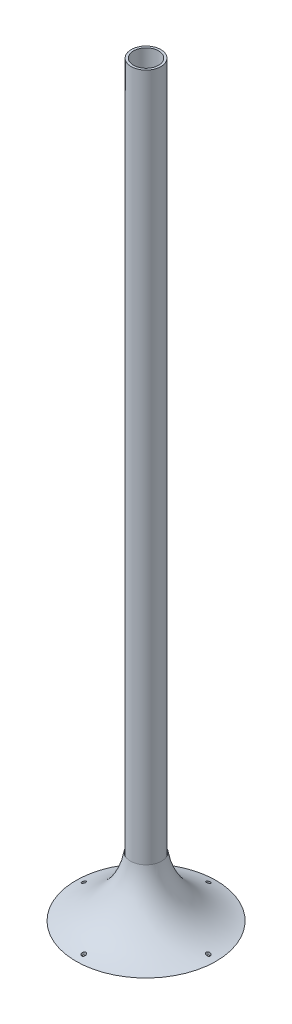
ISO-10303-21;
HEADER;
FILE_DESCRIPTION(('STEP AP214'),'2;1');
FILE_NAME('part.step','',(''),(''),'','','');
FILE_SCHEMA(('AUTOMOTIVE_DESIGN { 1 0 10303 214 1 1 1 1 }'));
ENDSEC;
DATA;
#1=APPLICATION_CONTEXT('core data for automotive mechanical design processes');
#2=APPLICATION_PROTOCOL_DEFINITION('international standard','automotive_design',2000,#1);
#3=PRODUCT_CONTEXT('',#1,'mechanical');
#4=PRODUCT('Part','Part','',(#3));
#5=PRODUCT_RELATED_PRODUCT_CATEGORY('part','',(#4));
#6=PRODUCT_DEFINITION_FORMATION('','',#4);
#7=PRODUCT_DEFINITION_CONTEXT('part definition',#1,'design');
#8=PRODUCT_DEFINITION('design','',#6,#7);
#9=PRODUCT_DEFINITION_SHAPE('','',#8);
#10=(LENGTH_UNIT() NAMED_UNIT(*) SI_UNIT(.MILLI.,.METRE.));
#11=(NAMED_UNIT(*) PLANE_ANGLE_UNIT() SI_UNIT($,.RADIAN.));
#12=(NAMED_UNIT(*) SI_UNIT($,.STERADIAN.) SOLID_ANGLE_UNIT());
#13=UNCERTAINTY_MEASURE_WITH_UNIT(LENGTH_MEASURE(1.E-05),#10,'distance_accuracy_value','');
#14=(GEOMETRIC_REPRESENTATION_CONTEXT(3) GLOBAL_UNCERTAINTY_ASSIGNED_CONTEXT((#13)) GLOBAL_UNIT_ASSIGNED_CONTEXT((#10,
#11,#12)) REPRESENTATION_CONTEXT('',''));
#15=CARTESIAN_POINT('',(0.,0.,0.));
#16=DIRECTION('',(0.,0.,1.));
#17=DIRECTION('',(1.,0.,0.));
#18=AXIS2_PLACEMENT_3D('',#15,#16,#17);
#19=CARTESIAN_POINT('',(0.,0.,0.));
#20=DIRECTION('',(0.,-1.,0.));
#21=DIRECTION('',(1.,0.,0.));
#22=AXIS2_PLACEMENT_3D('',#19,#20,#21);
#23=PLANE('',#22);
#24=CARTESIAN_POINT('',(0.,0.,101.6));
#25=DIRECTION('',(0.,-1.,0.));
#26=DIRECTION('',(1.,0.,0.));
#27=AXIS2_PLACEMENT_3D('',#24,#25,#26);
#28=CIRCLE('',#27,3.2385);
#29=CARTESIAN_POINT('',(3.2385,0.,101.6));
#30=VERTEX_POINT('',#29);
#31=EDGE_CURVE('E88',#30,#30,#28,.T.);
#32=ORIENTED_EDGE('',*,*,#31,.F.);
#33=EDGE_LOOP('',(#32));
#34=FACE_BOUND('',#33,.T.);
#35=CARTESIAN_POINT('',(101.6,0.,-3.54734504026462E-13));
#36=DIRECTION('',(0.,-1.,0.));
#37=DIRECTION('',(1.,0.,0.));
#38=AXIS2_PLACEMENT_3D('',#35,#36,#37);
#39=CIRCLE('',#38,3.2385);
#40=CARTESIAN_POINT('',(104.8385,0.,-3.54734504026462E-13));
#41=VERTEX_POINT('',#40);
#42=EDGE_CURVE('E118',#41,#41,#39,.T.);
#43=ORIENTED_EDGE('',*,*,#42,.F.);
#44=EDGE_LOOP('',(#43));
#45=FACE_BOUND('',#44,.T.);
#46=CARTESIAN_POINT('',(-7.09469008052925E-13,0.,-101.6));
#47=DIRECTION('',(0.,-1.,0.));
#48=DIRECTION('',(1.,0.,0.));
#49=AXIS2_PLACEMENT_3D('',#46,#47,#48);
#50=CIRCLE('',#49,3.2385);
#51=CARTESIAN_POINT('',(3.23849999999929,0.,-101.6));
#52=VERTEX_POINT('',#51);
#53=EDGE_CURVE('E124',#52,#52,#50,.T.);
#54=ORIENTED_EDGE('',*,*,#53,.F.);
#55=EDGE_LOOP('',(#54));
#56=FACE_BOUND('',#55,.T.);
#57=CARTESIAN_POINT('',(-101.6,0.,1.06420351207939E-12));
#58=DIRECTION('',(0.,-1.,0.));
#59=DIRECTION('',(1.,0.,0.));
#60=AXIS2_PLACEMENT_3D('',#57,#58,#59);
#61=CIRCLE('',#60,3.2385);
#62=CARTESIAN_POINT('',(-98.3615,0.,1.06420351207939E-12));
#63=VERTEX_POINT('',#62);
#64=EDGE_CURVE('E130',#63,#63,#61,.T.);
#65=ORIENTED_EDGE('',*,*,#64,.F.);
#66=EDGE_LOOP('',(#65));
#67=FACE_BOUND('',#66,.T.);
#68=CARTESIAN_POINT('',(0.,0.,0.));
#69=DIRECTION('',(0.,-1.,0.));
#70=DIRECTION('',(1.,0.,0.));
#71=AXIS2_PLACEMENT_3D('',#68,#69,#70);
#72=CIRCLE('',#71,114.3);
#73=CARTESIAN_POINT('',(114.3,0.,0.));
#74=VERTEX_POINT('',#73);
#75=EDGE_CURVE('E11',#74,#74,#72,.T.);
#76=ORIENTED_EDGE('',*,*,#75,.T.);
#77=EDGE_LOOP('',(#76));
#78=FACE_BOUND('',#77,.T.);
#79=CARTESIAN_POINT('',(0.,0.,0.));
#80=DIRECTION('',(0.,-1.,0.));
#81=DIRECTION('',(1.,0.,0.));
#82=AXIS2_PLACEMENT_3D('',#79,#80,#81);
#83=CIRCLE('',#82,25.4);
#84=CARTESIAN_POINT('',(25.4,0.,0.));
#85=VERTEX_POINT('',#84);
#86=EDGE_CURVE('E71',#85,#85,#83,.T.);
#87=ORIENTED_EDGE('',*,*,#86,.F.);
#88=EDGE_LOOP('',(#87));
#89=FACE_BOUND('',#88,.T.);
#90=ADVANCED_FACE('F54',(#34,#45,#56,#67,#78,#89),#23,.T.);
#91=CARTESIAN_POINT('',(0.,114.3,0.));
#92=DIRECTION('',(0.,-1.,0.));
#93=DIRECTION('',(1.,0.,0.));
#94=AXIS2_PLACEMENT_3D('',#91,#92,#93);
#95=TOROIDAL_SURFACE('',#94,141.658661971831,117.528661971831);
#96=CARTESIAN_POINT('',(-2.30929525105034,4.64826647005963,99.3295266137908));
#97=CARTESIAN_POINT('',(-2.44354343476462,4.59439528697215,99.4660815845304));
#98=CARTESIAN_POINT('',(-2.56500293451451,4.53650030870473,99.6139158078199));
#99=CARTESIAN_POINT('',(-2.77948637044557,4.41499559766829,99.9271275805299));
#100=CARTESIAN_POINT('',(-2.87245117066994,4.35137432999925,100.092540667176));
#101=CARTESIAN_POINT('',(-3.0276954884374,4.22083571490075,100.435419151226));
#102=CARTESIAN_POINT('',(-3.09005124763107,4.15392701839701,100.612853337364));
#103=CARTESIAN_POINT('',(-3.18316147748261,4.0187257452465,100.9752126998));
#104=CARTESIAN_POINT('',(-3.21392765653977,3.95043369090628,101.160135074233));
#105=CARTESIAN_POINT('',(-3.24365426421682,3.81213743220226,101.538666743752));
#106=CARTESIAN_POINT('',(-3.24156737143667,3.74214821548053,101.732364842528));
#107=CARTESIAN_POINT('',(-3.20277864042161,3.604612329658,102.117199226636));
#108=CARTESIAN_POINT('',(-3.16607176518049,3.53706601747054,102.308335135079));
#109=CARTESIAN_POINT('',(-3.0586723047523,3.40651372910752,102.68166228969));
#110=CARTESIAN_POINT('',(-2.9881007342943,3.34349249751042,102.863882859093));
#111=CARTESIAN_POINT('',(-2.81431150867336,3.22349241317938,103.214231310365));
#112=CARTESIAN_POINT('',(-2.71110053449406,3.1665123270632,103.382362067386));
#113=CARTESIAN_POINT('',(-2.47907188360341,3.06233813689233,103.692389393416));
#114=CARTESIAN_POINT('',(-2.35141866212503,3.01484765309085,103.83505678885));
#115=CARTESIAN_POINT('',(-2.07140053116697,2.92832779424922,104.096771547685));
#116=CARTESIAN_POINT('',(-1.9190438647404,2.88929560695808,104.215826760647));
#117=CARTESIAN_POINT('',(-1.60273999672914,2.82269597761183,104.420042332258));
#118=CARTESIAN_POINT('',(-1.43984871881718,2.79462695763421,104.506675108047));
#119=CARTESIAN_POINT('',(-1.10056775596652,2.74791690453407,104.651329016761));
#120=CARTESIAN_POINT('',(-0.924182029957986,2.72927311840488,104.709358504266));
#121=CARTESIAN_POINT('',(-0.571455967288421,2.70257222027363,104.792598601088));
#122=CARTESIAN_POINT('',(-0.395466859947218,2.69407866896,104.819161712552));
#123=CARTESIAN_POINT('',(-0.0413236174116718,2.68642527222907,104.84309355038));
#124=CARTESIAN_POINT('',(0.136830169613134,2.68726394514806,104.840466911157));
#125=CARTESIAN_POINT('',(0.486254323699183,2.69813166965856,104.806494265508));
#126=CARTESIAN_POINT('',(0.657590560765519,2.7079656595233,104.775757817581));
#127=CARTESIAN_POINT('',(0.99246744235379,2.73628701958079,104.687535053294));
#128=CARTESIAN_POINT('',(1.15600812764337,2.75477434451456,104.630048876842));
#129=CARTESIAN_POINT('',(1.47203367981221,2.80008595395555,104.48982669689));
#130=CARTESIAN_POINT('',(1.62443137440295,2.82696875947887,104.406913529067));
#131=CARTESIAN_POINT('',(1.91302695041082,2.88834905303608,104.218758558631));
#132=CARTESIAN_POINT('',(2.04922285089244,2.92284747073415,104.113514030012));
#133=CARTESIAN_POINT('',(2.30637468364967,2.99985960068305,103.88026625541));
#134=CARTESIAN_POINT('',(2.42669550101881,3.04259640089417,103.751637190987));
#135=CARTESIAN_POINT('',(2.64412979505348,3.13426946475203,103.47803523056));
#136=CARTESIAN_POINT('',(2.7412383932844,3.18320702829161,103.333058908314));
#137=CARTESIAN_POINT('',(2.91452663626111,3.28865612317234,103.023508950751));
#138=CARTESIAN_POINT('',(2.98946428019293,3.3454197408329,102.858326136073));
#139=CARTESIAN_POINT('',(3.11054579022987,3.46315670525127,102.519150879166));
#140=CARTESIAN_POINT('',(3.15668247393687,3.52413109788716,102.345156251128));
#141=CARTESIAN_POINT('',(3.22112401575917,3.65197784318253,101.98408794169));
#142=CARTESIAN_POINT('',(3.23792253013172,3.71899266146435,101.796795215783));
#143=CARTESIAN_POINT('',(3.23904849918665,3.85434895565471,101.422577276663));
#144=CARTESIAN_POINT('',(3.2233687059187,3.92269072431762,101.235652154803));
#145=CARTESIAN_POINT('',(3.15899518025132,4.06105277316863,100.861172591511));
#146=CARTESIAN_POINT('',(3.10925909130126,4.13105661789806,100.673790120216));
#147=CARTESIAN_POINT('',(2.97677876337958,4.26836875091501,100.309980597501));
#148=CARTESIAN_POINT('',(2.89403193856599,4.33567682757933,100.133554405573));
#149=CARTESIAN_POINT('',(2.69778070421146,4.46491316969144,99.7979349917253));
#150=CARTESIAN_POINT('',(2.58444803907258,4.52686899895948,99.6386522893421));
#151=CARTESIAN_POINT('',(2.3293083364836,4.6433534062151,99.3415696006705));
#152=CARTESIAN_POINT('',(2.18750864394508,4.69788389397153,99.2037640892094));
#153=CARTESIAN_POINT('',(1.88675227064989,4.7945074253292,98.9611565367842));
#154=CARTESIAN_POINT('',(1.72900616398302,4.83708561912939,98.8550499253526));
#155=CARTESIAN_POINT('',(1.39534890048712,4.91114087854992,98.6713326671425));
#156=CARTESIAN_POINT('',(1.21944749186623,4.9426238618941,98.5937068289935));
#157=CARTESIAN_POINT('',(0.868366258088667,4.99089705810202,98.4749999153707));
#158=CARTESIAN_POINT('',(0.694072380743383,5.00859257365448,98.4316634836138));
#159=CARTESIAN_POINT('',(0.339957818223821,5.03199014434717,98.3744088832708));
#160=CARTESIAN_POINT('',(0.160139519638052,5.0376973066262,98.3604781875828));
#161=CARTESIAN_POINT('',(-0.189691041294371,5.03683634597694,98.3625823982442));
#162=CARTESIAN_POINT('',(-0.359716798771849,5.03090418465711,98.377064834301));
#163=CARTESIAN_POINT('',(-0.694732987874885,5.0083153699062,98.4323432803409));
#164=CARTESIAN_POINT('',(-0.859722318043035,4.99165638789155,98.4731450037314));
#165=CARTESIAN_POINT('',(-1.17988928506436,4.94844767872076,98.5793747404198));
#166=CARTESIAN_POINT('',(-1.33507979017254,4.9219112529345,98.6447696367641));
#167=CARTESIAN_POINT('',(-1.63199515802965,4.86012672696105,98.7978007871578));
#168=CARTESIAN_POINT('',(-1.77373434979296,4.82488804438653,98.8854130002853));
#169=CARTESIAN_POINT('',(-1.97924394038993,4.7650310404283,99.035152825001));
#170=CARTESIAN_POINT('',(-2.04887380529895,4.74298974604147,99.0904497217147));
#171=CARTESIAN_POINT('',(-2.18300367722266,4.69700516629355,99.2062103989416));
#172=CARTESIAN_POINT('',(-2.24750412696408,4.67306204543901,99.2666737325963));
#173=CARTESIAN_POINT('',(-2.30929525105034,4.64826647005963,99.3295266137908));
#174=B_SPLINE_CURVE_WITH_KNOTS('',3,(#96,#97,#98,#99,#100,#101,#102,#103,#104,#105,#106,#107,
#108,#109,#110,#111,#112,#113,#114,#115,#116,#117,#118,#119,#120,#121,#122,#123,#124,#125,#126,
#127,#128,#129,#130,#131,#132,#133,#134,#135,#136,#137,#138,#139,#140,#141,#142,#143,#144,#145,
#146,#147,#148,#149,#150,#151,#152,#153,#154,#155,#156,#157,#158,#159,#160,#161,#162,#163,#164,
#165,#166,#167,#168,#169,#170,#171,#172,#173),.UNSPECIFIED.,.T.,.F.,(4,2,2,2,2,2,2,2,2,2,2,2,2,
2,2,2,2,2,2,2,2,2,2,2,2,2,2,2,2,2,2,2,2,2,2,2,2,2,4),(0.,0.59642907601406,1.19408768780807,
1.79024998802465,2.38619124609189,3.00116791252539,3.61623406829412,4.22911848384881,
4.84187752875225,5.43057870646303,6.01908384892127,6.57610930088673,7.13297195773208,
7.66491369993202,8.19677098771815,8.71736161937451,9.23794952824931,9.76225041105252,
10.2866153325089,10.8279340805677,11.3693664959491,11.9370320266178,12.5048390655113,
13.1010261440787,13.6973462837626,14.3127853048001,14.9282725447153,15.5403731550182,
16.1523160368729,16.7336964366836,17.3147662814013,17.8533890587149,18.3917823316452,
18.901576036062,19.4114804440759,19.9207006636501,20.4293721999155,20.7039174986347,
20.9784390752027),.UNSPECIFIED.);
#175=CARTESIAN_POINT('',(-2.30929525105034,4.64826647005963,99.3295266137908));
#176=VERTEX_POINT('',#175);
#177=EDGE_CURVE('E59',#176,#176,#174,.T.);
#178=ORIENTED_EDGE('',*,*,#177,.F.);
#179=EDGE_LOOP('',(#178));
#180=FACE_BOUND('',#179,.T.);
#181=CARTESIAN_POINT('',(98.9367420931442,4.80438595188609,-1.84253617917576));
#182=CARTESIAN_POINT('',(98.8399677593906,4.84313834807318,-1.70264812349893));
#183=CARTESIAN_POINT('',(98.7536788961852,4.87790619972581,-1.55431243654883));
#184=CARTESIAN_POINT('',(98.6051011285243,4.93798846619797,-1.24420113424935));
#185=CARTESIAN_POINT('',(98.5428217186514,4.96329914103798,-1.08242023264376));
#186=CARTESIAN_POINT('',(98.4446233471107,5.00329059928821,-0.749434084006235));
#187=CARTESIAN_POINT('',(98.4087513090254,5.01795246007419,-0.578212639259197));
#188=CARTESIAN_POINT('',(98.365080329619,5.03580999905111,-0.23165722455757));
#189=CARTESIAN_POINT('',(98.3572750104721,5.03900828220225,-0.0563241980266586));
#190=CARTESIAN_POINT('',(98.3698644614795,5.0338558995717,0.287910002214199));
#191=CARTESIAN_POINT('',(98.389428153372,5.02584558865043,0.456847482004698));
#192=CARTESIAN_POINT('',(98.4544765131783,4.99928192012043,0.788777305906589));
#193=CARTESIAN_POINT('',(98.4999613357125,4.98072849962171,0.95176961454868));
#194=CARTESIAN_POINT('',(98.6153122783344,4.93386554813559,1.2680579145589));
#195=CARTESIAN_POINT('',(98.6852690380838,4.9055197528765,1.4213153210396));
#196=CARTESIAN_POINT('',(98.8470549286339,4.8403119247384,1.71380467479733));
#197=CARTESIAN_POINT('',(98.9388881737383,4.80344828995117,1.85303397679592));
#198=CARTESIAN_POINT('',(99.1466579500181,4.72057604844975,2.12112751708642));
#199=CARTESIAN_POINT('',(99.2635751190879,4.67420050256016,2.24911716389742));
#200=CARTESIAN_POINT('',(99.514822532309,4.57530847000922,2.48384825809695));
#201=CARTESIAN_POINT('',(99.6491580805682,4.52279011326637,2.59058320796377));
#202=CARTESIAN_POINT('',(99.9415172381204,4.40946064981896,2.78756178921429));
#203=CARTESIAN_POINT('',(100.100539048205,4.34832672497345,2.87613898101627));
#204=CARTESIAN_POINT('',(100.430076169255,4.22287239027717,3.02520950018011));
#205=CARTESIAN_POINT('',(100.600594910884,4.15855103083239,3.08569440199848));
#206=CARTESIAN_POINT('',(100.958610512223,4.02487267738655,3.18003960650001));
#207=CARTESIAN_POINT('',(101.146523165204,3.95543563822972,3.21221558710688));
#208=CARTESIAN_POINT('',(101.525264853861,3.81700651764503,3.24321012362954));
#209=CARTESIAN_POINT('',(101.716094367058,3.74801451176067,3.24202315793215));
#210=CARTESIAN_POINT('',(102.098982865887,3.61107526555774,3.20570677391838));
#211=CARTESIAN_POINT('',(102.290998157702,3.54317165980357,3.16994331210049));
#212=CARTESIAN_POINT('',(102.666847261033,3.41165519705931,3.06395662981789));
#213=CARTESIAN_POINT('',(102.850681665621,3.34804202886141,2.99373591178176));
#214=CARTESIAN_POINT('',(103.200139014324,3.22829372121628,2.82213641319951));
#215=CARTESIAN_POINT('',(103.366083171758,3.17202042595456,2.72150999940001));
#216=CARTESIAN_POINT('',(103.678784418379,3.06687560278763,2.49083325789969));
#217=CARTESIAN_POINT('',(103.825546926471,3.01800198381836,2.36079126870876));
#218=CARTESIAN_POINT('',(104.087752069446,2.93129998177295,2.0817793710843));
#219=CARTESIAN_POINT('',(104.204381450978,2.89304608388134,1.93405751027627));
#220=CARTESIAN_POINT('',(104.410980101924,2.8256355667873,1.61916472783316));
#221=CARTESIAN_POINT('',(104.500958196559,2.79647593596873,1.45200026995048));
#222=CARTESIAN_POINT('',(104.646796190101,2.74937791380621,1.11234006929568));
#223=CARTESIAN_POINT('',(104.704180548028,2.73093697768059,0.940567723448616));
#224=CARTESIAN_POINT('',(104.789585141468,2.70353622154736,0.589152007721813));
#225=CARTESIAN_POINT('',(104.817612257054,2.69457418009049,0.409510492322444));
#226=CARTESIAN_POINT('',(104.842776232322,2.68652675299022,0.0541140750643192));
#227=CARTESIAN_POINT('',(104.840945402515,2.68711130387327,-0.121561109589414));
#228=CARTESIAN_POINT('',(104.808980280939,2.69733603020385,-0.470036455473887));
#229=CARTESIAN_POINT('',(104.778848316397,2.70697546106085,-0.642836851911879));
#230=CARTESIAN_POINT('',(104.69171375365,2.73494383146165,-0.979378277758448));
#231=CARTESIAN_POINT('',(104.634913535853,2.75320733044567,-1.1431773323845));
#232=CARTESIAN_POINT('',(104.496502919491,2.79792403491012,-1.45871194929779));
#233=CARTESIAN_POINT('',(104.414891028467,2.82437773304466,-1.61044678521198));
#234=CARTESIAN_POINT('',(104.227680879256,2.88542790146023,-1.90095634092829));
#235=CARTESIAN_POINT('',(104.121632239248,2.92017777371963,-2.0394081289384));
#236=CARTESIAN_POINT('',(103.889925683343,2.99666025358289,-2.29653921428517));
#237=CARTESIAN_POINT('',(103.764264405419,3.0383940584715,-2.41521511438472));
#238=CARTESIAN_POINT('',(103.491485337223,3.12973644579643,-2.63478227031511));
#239=CARTESIAN_POINT('',(103.34369201387,3.17960055882698,-2.73472728649932));
#240=CARTESIAN_POINT('',(103.03522150842,3.28465123846383,-2.90850209286279));
#241=CARTESIAN_POINT('',(102.874541266353,3.33983906980951,-2.98232565790856));
#242=CARTESIAN_POINT('',(102.536144334647,3.45721318516211,-3.10573468192253));
#243=CARTESIAN_POINT('',(102.35797649639,3.51961335003513,-3.15388011635038));
#244=CARTESIAN_POINT('',(101.99709046235,3.64735329244376,-3.21929407940748));
#245=CARTESIAN_POINT('',(101.814371315778,3.71269368654539,-3.23655610056113));
#246=CARTESIAN_POINT('',(101.441089086341,3.8475990119921,-3.24021134290032));
#247=CARTESIAN_POINT('',(101.250533035706,3.91722361525117,-3.22521915286044));
#248=CARTESIAN_POINT('',(100.874755916865,4.05600478316322,-3.16199660780068));
#249=CARTESIAN_POINT('',(100.689537020898,4.12516114872034,-3.11375291294571));
#250=CARTESIAN_POINT('',(100.326681467808,4.26202122049596,-2.9840038314924));
#251=CARTESIAN_POINT('',(100.149218095155,4.32968274268147,-2.90196797365671));
#252=CARTESIAN_POINT('',(99.8107074772524,4.4599605172853,-2.70636929042384));
#253=CARTESIAN_POINT('',(99.6496410894754,4.52258263458951,-2.59284381795078));
#254=CARTESIAN_POINT('',(99.3936358383796,4.62292392335037,-2.37470437839025));
#255=CARTESIAN_POINT('',(99.2932006207211,4.66254208166673,-2.27732993887284));
#256=CARTESIAN_POINT('',(99.1050069569561,4.73715410367057,-2.06942960551507));
#257=CARTESIAN_POINT('',(99.0172464495691,4.77214871920303,-1.95890585548331));
#258=CARTESIAN_POINT('',(98.9367420931442,4.80438595188609,-1.84253617917576));
#259=B_SPLINE_CURVE_WITH_KNOTS('',3,(#181,#182,#183,#184,#185,#186,#187,#188,#189,#190,#191,
#192,#193,#194,#195,#196,#197,#198,#199,#200,#201,#202,#203,#204,#205,#206,#207,#208,#209,#210,
#211,#212,#213,#214,#215,#216,#217,#218,#219,#220,#221,#222,#223,#224,#225,#226,#227,#228,#229,
#230,#231,#232,#233,#234,#235,#236,#237,#238,#239,#240,#241,#242,#243,#244,#245,#246,#247,#248,
#249,#250,#251,#252,#253,#254,#255,#256,#257,#258),.UNSPECIFIED.,.T.,.F.,(4,2,2,2,2,2,2,2,2,2,2,
2,2,2,2,2,2,2,2,2,2,2,2,2,2,2,2,2,2,2,2,2,2,2,2,2,2,2,4),(0.,0.522891717183656,1.04599000126599,
1.57001555619412,2.09392202506308,2.60226052710426,3.11060206143217,3.62084669258953,
4.13118736116142,4.66721839119513,5.20341303422139,5.77695423141997,6.35066733630918,
6.95657129911427,7.56257554044308,8.17990731838553,8.79719426977272,9.40030903151947,
10.0032530405303,10.5764940283576,11.1495449822446,11.692944953436,12.2362175465769,
12.7607480615905,13.2852354477862,13.805805385772,14.3264066429917,14.8575028648866,
15.3886902282731,15.9419946236507,16.4954307910923,17.0772987436627,17.6592892877909,
18.2667753606967,18.8745052867623,19.4921627588043,20.109090676995,20.5441431777656,
20.9791248463444),.UNSPECIFIED.);
#260=CARTESIAN_POINT('',(98.9367420931442,4.80438595188609,-1.84253617917576));
#261=VERTEX_POINT('',#260);
#262=EDGE_CURVE('E131',#261,#261,#259,.T.);
#263=ORIENTED_EDGE('',*,*,#262,.F.);
#264=EDGE_LOOP('',(#263));
#265=FACE_BOUND('',#264,.T.);
#266=CARTESIAN_POINT('',(-2.43080600331008,3.0466376202067,-103.739874861826));
#267=CARTESIAN_POINT('',(-2.55596398327747,3.09405248297422,-103.597685940003));
#268=CARTESIAN_POINT('',(-2.66810393518241,3.14533495249078,-103.445065727325));
#269=CARTESIAN_POINT('',(-2.86359531361786,3.25421548352978,-103.124182377835));
#270=CARTESIAN_POINT('',(-2.94689214822474,3.31182525244467,-102.955890334011));
#271=CARTESIAN_POINT('',(-3.08276528090101,3.43166082110469,-102.609434295805));
#272=CARTESIAN_POINT('',(-3.13541938648856,3.4938744734533,-102.43129657339));
#273=CARTESIAN_POINT('',(-3.20954308098273,3.62145764489903,-102.069849182758));
#274=CARTESIAN_POINT('',(-3.2310217975339,3.68682623448816,-101.886541044383));
#275=CARTESIAN_POINT('',(-3.2429129381643,3.82152644805609,-101.512812826545));
#276=CARTESIAN_POINT('',(-3.2321687894872,3.89091578109486,-101.322376234099));
#277=CARTESIAN_POINT('',(-3.17750882685391,4.02946831581159,-100.946193757117));
#278=CARTESIAN_POINT('',(-3.1335845650588,4.09863145539471,-100.760449079618));
#279=CARTESIAN_POINT('',(-3.0124002452715,4.23593963420347,-100.395434543507));
#280=CARTESIAN_POINT('',(-2.93454184136709,4.30404254267763,-100.216346639417));
#281=CARTESIAN_POINT('',(-2.7470028977368,4.43557074084996,-99.8737372236644));
#282=CARTESIAN_POINT('',(-2.63732381698443,4.49899624483927,-99.7102149987747));
#283=CARTESIAN_POINT('',(-2.39164656010215,4.61719256174272,-99.4079949688727));
#284=CARTESIAN_POINT('',(-2.25636838579378,4.67213897249799,-99.2687821797782));
#285=CARTESIAN_POINT('',(-1.96108252164939,4.77278776178207,-99.0154638719257));
#286=CARTESIAN_POINT('',(-1.80108524034231,4.81849401247111,-98.901347834412));
#287=CARTESIAN_POINT('',(-1.47181364581453,4.89575507723351,-98.709392859453));
#288=CARTESIAN_POINT('',(-1.30379193456198,4.9280293519892,-98.629697044459));
#289=CARTESIAN_POINT('',(-0.95494783303642,4.98074073153641,-98.4999138648371));
#290=CARTESIAN_POINT('',(-0.774132123615884,5.0011839638857,-98.4498111730004));
#291=CARTESIAN_POINT('',(-0.418543052663774,5.02809352023277,-98.3839321729444));
#292=CARTESIAN_POINT('',(-0.244233760328115,5.03543865344913,-98.3659970529207));
#293=CARTESIAN_POINT('',(0.105078082231033,5.03850788182355,-98.358497970085));
#294=CARTESIAN_POINT('',(0.28008045674848,5.034234754898,-98.3689272253745));
#295=CARTESIAN_POINT('',(0.619682856684914,5.01463500945771,-98.4168707548188));
#296=CARTESIAN_POINT('',(0.784435174450694,4.99968163823097,-98.4534704853028));
#297=CARTESIAN_POINT('',(1.10517173559019,4.95985488607095,-98.5512962885561));
#298=CARTESIAN_POINT('',(1.26115549792103,4.93498096150097,-98.6125237109005));
#299=CARTESIAN_POINT('',(1.5636242837019,4.87579648411887,-98.7589121107768));
#300=CARTESIAN_POINT('',(1.70984368734862,4.8413001160922,-98.8445451672287));
#301=CARTESIAN_POINT('',(1.98585223640612,4.76452255575605,-99.0363044636797));
#302=CARTESIAN_POINT('',(2.11563739524648,4.72223948065208,-99.1424356603503));
#303=CARTESIAN_POINT('',(2.36349098719803,4.62866153279002,-99.378992158846));
#304=CARTESIAN_POINT('',(2.48038205434201,4.57697714576705,-99.510496045888));
#305=CARTESIAN_POINT('',(2.69061537235688,4.4683580086911,-99.7892072181061));
#306=CARTESIAN_POINT('',(2.78395015497977,4.4114216013382,-99.9364194624422));
#307=CARTESIAN_POINT('',(2.95101296065327,4.28998216570984,-100.253287062987));
#308=CARTESIAN_POINT('',(3.02295419476669,4.22522802720814,-100.423789416461));
#309=CARTESIAN_POINT('',(3.13674731922689,4.09365586315056,-100.773810456331));
#310=CARTESIAN_POINT('',(3.1785910771223,4.02683728485805,-100.953331565621));
#311=CARTESIAN_POINT('',(3.23251986239154,3.88990803509134,-101.325118308411));
#312=CARTESIAN_POINT('',(3.24315814486927,3.81978641299494,-101.517591506133));
#313=CARTESIAN_POINT('',(3.2301175617129,3.68126444203438,-101.902023219128));
#314=CARTESIAN_POINT('',(3.20643541869556,3.61286425819126,-102.093981683493));
#315=CARTESIAN_POINT('',(3.12473858973573,3.47935643390501,-102.472680432825));
#316=CARTESIAN_POINT('',(3.0665718727859,3.41426476778363,-102.659393752431));
#317=CARTESIAN_POINT('',(2.91673475467567,3.28951867228574,-103.020842286337));
#318=CARTESIAN_POINT('',(2.82506953220907,3.22986340425054,-103.195579347149));
#319=CARTESIAN_POINT('',(2.61387017158557,3.11961235877009,-103.521451874448));
#320=CARTESIAN_POINT('',(2.49538816864268,3.06877772166593,-103.673187326952));
#321=CARTESIAN_POINT('',(2.23187177730128,2.97523122211491,-103.954514382162));
#322=CARTESIAN_POINT('',(2.08684582402763,2.93251678799958,-104.08411299428));
#323=CARTESIAN_POINT('',(1.78257792025502,2.85849604798044,-104.31003684725));
#324=CARTESIAN_POINT('',(1.62448827244032,2.82670708439339,-104.407755888182));
#325=CARTESIAN_POINT('',(1.29262957767905,2.77247346318992,-104.575145846009));
#326=CARTESIAN_POINT('',(1.11886538309816,2.75002592574737,-104.64482540685));
#327=CARTESIAN_POINT('',(0.769585813777588,2.71597413383566,-104.750766522748));
#328=CARTESIAN_POINT('',(0.594551252650199,2.70390281977506,-104.788466373959));
#329=CARTESIAN_POINT('',(0.240290913689343,2.68916845951006,-104.834505490038));
#330=CARTESIAN_POINT('',(0.0610661180543054,2.68650323032372,-104.842851567382));
#331=CARTESIAN_POINT('',(-0.291464544756656,2.69059612797222,-104.830050952453));
#332=CARTESIAN_POINT('',(-0.464801969494854,2.69710788841546,-104.809675322774));
#333=CARTESIAN_POINT('',(-0.805472948665229,2.71894400316672,-104.741539571308));
#334=CARTESIAN_POINT('',(-0.972805052756399,2.73427047129422,-104.693772880989));
#335=CARTESIAN_POINT('',(-1.29719070395346,2.77337612894432,-104.572416081198));
#336=CARTESIAN_POINT('',(-1.45421879136459,2.79717538612007,-104.498764669566));
#337=CARTESIAN_POINT('',(-1.75337437243035,2.85259912547912,-104.328212778348));
#338=CARTESIAN_POINT('',(-1.89551927517904,2.88421431632745,-104.231339907823));
#339=CARTESIAN_POINT('',(-2.10128936418952,2.93853923193492,-104.06601000425));
#340=CARTESIAN_POINT('',(-2.17132240764684,2.95879848999401,-104.004550523759));
#341=CARTESIAN_POINT('',(-2.30553898493048,3.00127737715286,-103.876180302897));
#342=CARTESIAN_POINT('',(-2.36972288266338,3.02349688412555,-103.809269902147));
#343=CARTESIAN_POINT('',(-2.43080600331008,3.0466376202067,-103.739874861826));
#344=B_SPLINE_CURVE_WITH_KNOTS('',3,(#266,#267,#268,#269,#270,#271,#272,#273,#274,#275,#276,
#277,#278,#279,#280,#281,#282,#283,#284,#285,#286,#287,#288,#289,#290,#291,#292,#293,#294,#295,
#296,#297,#298,#299,#300,#301,#302,#303,#304,#305,#306,#307,#308,#309,#310,#311,#312,#313,#314,
#315,#316,#317,#318,#319,#320,#321,#322,#323,#324,#325,#326,#327,#328,#329,#330,#331,#332,#333,
#334,#335,#336,#337,#338,#339,#340,#341,#342,#343),.UNSPECIFIED.,.T.,.F.,(4,2,2,2,2,2,2,2,2,2,2,
2,2,2,2,2,2,2,2,2,2,2,2,2,2,2,2,2,2,2,2,2,2,2,2,2,2,2,4),(0.,0.585443457808653,1.17198901537888,
1.75703865356029,2.34191696419008,2.94803646906868,3.5543103473356,4.17173657354398,
4.7891344953202,5.39122422949824,5.99306112793154,6.55630925530733,7.11926540238358,
7.64278435479766,8.16617814527167,8.67212318417851,9.17809595219243,9.69461070901309,
10.211250521401,10.7590236424554,11.3069702111148,11.8925487682824,12.4782854916025,
13.0907795804881,13.7033321625336,14.3186055798671,14.9337839193575,15.5280709644172,
16.1221694840614,16.684952155191,17.2475611998303,17.7832749642096,18.3188643909477,
18.8403461430374,19.3619530017352,19.8848035873464,20.4070355885083,20.6927779750437,
20.978502571865),.UNSPECIFIED.);
#345=CARTESIAN_POINT('',(-2.43080600331008,3.0466376202067,-103.739874861826));
#346=VERTEX_POINT('',#345);
#347=EDGE_CURVE('E81',#346,#346,#344,.T.);
#348=ORIENTED_EDGE('',*,*,#347,.F.);
#349=EDGE_LOOP('',(#348));
#350=FACE_BOUND('',#349,.T.);
#351=CARTESIAN_POINT('',(-104.419297799494,2.82299973061598,-1.59356272875651));
#352=CARTESIAN_POINT('',(-104.504477319973,2.79532541673389,-1.44285200570863));
#353=CARTESIAN_POINT('',(-104.57790184562,2.7716048260637,-1.28465780341915));
#354=CARTESIAN_POINT('',(-104.69863423435,2.7327078917007,-0.957492573553556));
#355=CARTESIAN_POINT('',(-104.745922312172,2.7175380207213,-0.788513489472881));
#356=CARTESIAN_POINT('',(-104.812633640519,2.69616139666015,-0.444489021630026));
#357=CARTESIAN_POINT('',(-104.832044347934,2.68995867823968,-0.269440943446178));
#358=CARTESIAN_POINT('',(-104.842229522308,2.68670222802287,0.0815397632204299));
#359=CARTESIAN_POINT('',(-104.833009310539,2.6896467961345,0.257472221266733));
#360=CARTESIAN_POINT('',(-104.786549939658,2.70451667548326,0.603220334727177));
#361=CARTESIAN_POINT('',(-104.749619833706,2.7163429290829,0.773081965564032));
#362=CARTESIAN_POINT('',(-104.649424742113,2.74854737799642,1.10398365592104));
#363=CARTESIAN_POINT('',(-104.586158874592,2.76892585969069,1.26502341982749));
#364=CARTESIAN_POINT('',(-104.434690637862,2.81796436071369,1.57561789990464));
#365=CARTESIAN_POINT('',(-104.346238486605,2.84670740081767,1.72503745582984));
#366=CARTESIAN_POINT('',(-104.147608108603,2.91166895414481,2.00681426014844));
#367=CARTESIAN_POINT('',(-104.037426985889,2.94788846383782,2.13916923033615));
#368=CARTESIAN_POINT('',(-103.794586990419,3.02831578351264,2.38808274818802));
#369=CARTESIAN_POINT('',(-103.661280522013,3.07275728143153,2.50393331132221));
#370=CARTESIAN_POINT('',(-103.379098166267,3.16764818651264,2.7117181857942));
#371=CARTESIAN_POINT('',(-103.230218923785,3.21809888867883,2.80364732834157));
#372=CARTESIAN_POINT('',(-102.913377736879,3.3264710783648,2.96582758291862));
#373=CARTESIAN_POINT('',(-102.744836160629,3.38463865575024,3.03478158986347));
#374=CARTESIAN_POINT('',(-102.399900194482,3.50490816734199,3.14336777061142));
#375=CARTESIAN_POINT('',(-102.22350384515,3.56701108490286,3.18299258408192));
#376=CARTESIAN_POINT('',(-101.858711651906,3.69678613582704,3.23364995613885));
#377=CARTESIAN_POINT('',(-101.67015134687,3.76458205298136,3.2431864381312));
#378=CARTESIAN_POINT('',(-101.294539581387,3.90110302608691,3.22953776795438));
#379=CARTESIAN_POINT('',(-101.107488452073,3.96982827754537,3.20634562105052));
#380=CARTESIAN_POINT('',(-100.734578408593,4.10828172930044,3.12670855828725));
#381=CARTESIAN_POINT('',(-100.548907793261,4.17798210343218,3.06932836403558));
#382=CARTESIAN_POINT('',(-100.189765723962,4.31416622945533,2.92178179561654));
#383=CARTESIAN_POINT('',(-100.016294895404,4.3806498163871,2.83161374207399));
#384=CARTESIAN_POINT('',(-99.6886927919914,4.50734566409459,2.62149750811296));
#385=CARTESIAN_POINT('',(-99.5343758437774,4.56761698213508,2.50187546279647));
#386=CARTESIAN_POINT('',(-99.2482738510465,4.68021843481886,2.23505870419806));
#387=CARTESIAN_POINT('',(-99.1164819625769,4.73255098101168,2.08787239455378));
#388=CARTESIAN_POINT('',(-98.8870353837756,4.82421435525199,1.77841929761508));
#389=CARTESIAN_POINT('',(-98.7879169843816,4.86409637484816,1.61740323798618));
#390=CARTESIAN_POINT('',(-98.618590164385,4.93250685592966,1.27862328796792));
#391=CARTESIAN_POINT('',(-98.5483661032449,4.96104145950293,1.10086852246592));
#392=CARTESIAN_POINT('',(-98.4440216864059,5.0035353676623,0.747717811531994));
#393=CARTESIAN_POINT('',(-98.4076377134923,5.01840752251348,0.573099001678519));
#394=CARTESIAN_POINT('',(-98.3640625672553,5.03622650317459,0.219675707876447));
#395=CARTESIAN_POINT('',(-98.3568614204987,5.03917740315491,0.0408726749302147));
#396=CARTESIAN_POINT('',(-98.3715879688505,5.03315065497373,-0.306642045253612));
#397=CARTESIAN_POINT('',(-98.3921283219742,5.02474113249069,-0.475424717465942));
#398=CARTESIAN_POINT('',(-98.4590737569631,4.99740652671239,-0.806875542882806));
#399=CARTESIAN_POINT('',(-98.5054782021478,4.97848170226587,-0.969543846495775));
#400=CARTESIAN_POINT('',(-98.6226265213929,4.93090013622479,-1.28514402118653));
#401=CARTESIAN_POINT('',(-98.6934771167322,4.90220073026179,-1.43802965706034));
#402=CARTESIAN_POINT('',(-98.8569737232198,4.83632613011999,-1.72963877490377));
#403=CARTESIAN_POINT('',(-98.9496239776909,4.79914928584389,-1.86835949211151));
#404=CARTESIAN_POINT('',(-99.1590409240431,4.71565662913486,-2.13537710858592));
#405=CARTESIAN_POINT('',(-99.2767964053743,4.66897148665265,-2.26278185789002));
#406=CARTESIAN_POINT('',(-99.5296286087888,4.56950873163323,-2.49621255888956));
#407=CARTESIAN_POINT('',(-99.6647106564532,4.51672924640779,-2.6022319115779));
#408=CARTESIAN_POINT('',(-99.9585128238532,4.40291080987267,-2.79761423310316));
#409=CARTESIAN_POINT('',(-100.118224232065,4.3415525895993,-2.8853014906726));
#410=CARTESIAN_POINT('',(-100.449008812558,4.21571105164197,-3.03247403500498));
#411=CARTESIAN_POINT('',(-100.62008536788,4.15122680499764,-3.09195088115737));
#412=CARTESIAN_POINT('',(-100.979008104108,4.01731157878918,-3.18409295421818));
#413=CARTESIAN_POINT('',(-101.167257807248,3.94780491449218,-3.21508344653133));
#414=CARTESIAN_POINT('',(-101.546480495319,3.8093106740163,-3.24363767796271));
#415=CARTESIAN_POINT('',(-101.737453820428,3.74032316435237,-3.24119720442171));
#416=CARTESIAN_POINT('',(-102.120252402432,3.60352765107141,-3.20232378303676));
#417=CARTESIAN_POINT('',(-102.312032420174,3.5357624367958,-3.16528713825207));
#418=CARTESIAN_POINT('',(-102.687248237862,3.40457122142795,-3.05677989040125));
#419=CARTESIAN_POINT('',(-102.870682595892,3.34114596922349,-2.98530336154238));
#420=CARTESIAN_POINT('',(-103.219082056813,3.22184886433951,-2.81131713663624));
#421=CARTESIAN_POINT('',(-103.38437635005,3.16583617216731,-2.70956393604861));
#422=CARTESIAN_POINT('',(-103.695422540445,3.06131827532169,-2.47683075249564));
#423=CARTESIAN_POINT('',(-103.841204062317,3.01280167223411,-2.34589589816423));
#424=CARTESIAN_POINT('',(-104.059622973454,2.9406182604062,-2.11041594122642));
#425=CARTESIAN_POINT('',(-104.13965906874,2.91430592283522,-2.01342452238838));
#426=CARTESIAN_POINT('',(-104.288327467588,2.86562329087113,-1.8101452464349));
#427=CARTESIAN_POINT('',(-104.356960511413,2.84325274057905,-1.70385799347145));
#428=CARTESIAN_POINT('',(-104.419297799494,2.82299973061598,-1.59356272875651));
#429=B_SPLINE_CURVE_WITH_KNOTS('',3,(#351,#352,#353,#354,#355,#356,#357,#358,#359,#360,#361,
#362,#363,#364,#365,#366,#367,#368,#369,#370,#371,#372,#373,#374,#375,#376,#377,#378,#379,#380,
#381,#382,#383,#384,#385,#386,#387,#388,#389,#390,#391,#392,#393,#394,#395,#396,#397,#398,#399,
#400,#401,#402,#403,#404,#405,#406,#407,#408,#409,#410,#411,#412,#413,#414,#415,#416,#417,#418,
#419,#420,#421,#422,#423,#424,#425,#426,#427,#428),.UNSPECIFIED.,.T.,.F.,(4,2,2,2,2,2,2,2,2,2,2,
2,2,2,2,2,2,2,2,2,2,2,2,2,2,2,2,2,2,2,2,2,2,2,2,2,2,2,4),(0.,0.525491952855211,1.05138115959115,
1.57750691021861,2.10353488226771,2.6237815960791,3.14404573229145,3.66966083950099,
4.19534604639686,4.73928265830212,5.28333670320668,5.85430008914553,6.42540671314834,
7.0244961008305,7.62371354477851,8.24012903737756,8.85657610686968,9.46648233162795,
10.0762029134312,10.6528572837915,11.2291990985427,11.7634173231311,12.2974529595339,
12.8057469176046,13.3140283638684,13.8245574247578,14.3351859429091,14.8718507520977,
15.4086809103549,15.982923173931,16.5573371437068,17.1636910086315,17.7701212813306,
18.3873353553963,19.0046556664474,19.6076891150717,20.2097963812759,20.5943943527671,
20.978967347134),.UNSPECIFIED.);
#430=CARTESIAN_POINT('',(-104.419297799494,2.82299973061598,-1.59356272875651));
#431=VERTEX_POINT('',#430);
#432=EDGE_CURVE('E80',#431,#431,#429,.T.);
#433=ORIENTED_EDGE('',*,*,#432,.F.);
#434=EDGE_LOOP('',(#433));
#435=FACE_BOUND('',#434,.T.);
#436=CARTESIAN_POINT('',(0.,97.0689262839356,0.));
#437=DIRECTION('',(0.,-1.,0.));
#438=DIRECTION('',(1.,0.,0.));
#439=AXIS2_PLACEMENT_3D('',#436,#437,#438);
#440=CIRCLE('',#439,25.4);
#441=CARTESIAN_POINT('',(25.4,97.0689262839356,0.));
#442=VERTEX_POINT('',#441);
#443=EDGE_CURVE('E70',#442,#442,#440,.T.);
#444=ORIENTED_EDGE('',*,*,#443,.T.);
#445=EDGE_LOOP('',(#444));
#446=FACE_BOUND('',#445,.T.);
#447=ORIENTED_EDGE('',*,*,#75,.F.);
#448=EDGE_LOOP('',(#447));
#449=FACE_BOUND('',#448,.T.);
#450=ADVANCED_FACE('F93',(#180,#265,#350,#435,#446,#449),#95,.F.);
#451=CARTESIAN_POINT('',(0.,0.,0.));
#452=DIRECTION('',(0.,-1.,0.));
#453=DIRECTION('',(1.,0.,0.));
#454=AXIS2_PLACEMENT_3D('',#451,#452,#453);
#455=CYLINDRICAL_SURFACE('',#454,25.4);
#456=ORIENTED_EDGE('',*,*,#443,.F.);
#457=EDGE_LOOP('',(#456));
#458=FACE_BOUND('',#457,.T.);
#459=ORIENTED_EDGE('',*,*,#86,.T.);
#460=EDGE_LOOP('',(#459));
#461=FACE_BOUND('',#460,.T.);
#462=ADVANCED_FACE('F98',(#458,#461),#455,.F.);
#463=CARTESIAN_POINT('',(-101.6,1219.2,1.06420351207939E-12));
#464=DIRECTION('',(0.,-1.,0.));
#465=DIRECTION('',(1.,0.,0.));
#466=AXIS2_PLACEMENT_3D('',#463,#464,#465);
#467=CYLINDRICAL_SURFACE('',#466,3.2385);
#468=ORIENTED_EDGE('',*,*,#432,.T.);
#469=EDGE_LOOP('',(#468));
#470=FACE_BOUND('',#469,.T.);
#471=ORIENTED_EDGE('',*,*,#64,.T.);
#472=EDGE_LOOP('',(#471));
#473=FACE_BOUND('',#472,.T.);
#474=ADVANCED_FACE('F94',(#470,#473),#467,.F.);
#475=CARTESIAN_POINT('',(-7.02530114149018E-13,1219.2,-101.6));
#476=DIRECTION('',(0.,-1.,0.));
#477=DIRECTION('',(1.,0.,0.));
#478=AXIS2_PLACEMENT_3D('',#475,#476,#477);
#479=CYLINDRICAL_SURFACE('',#478,3.2385);
#480=ORIENTED_EDGE('',*,*,#347,.T.);
#481=EDGE_LOOP('',(#480));
#482=FACE_BOUND('',#481,.T.);
#483=ORIENTED_EDGE('',*,*,#53,.T.);
#484=EDGE_LOOP('',(#483));
#485=FACE_BOUND('',#484,.T.);
#486=ADVANCED_FACE('F100',(#482,#485),#479,.F.);
#487=CARTESIAN_POINT('',(101.6,1219.2,-3.54734504026462E-13));
#488=DIRECTION('',(0.,-1.,0.));
#489=DIRECTION('',(1.,0.,0.));
#490=AXIS2_PLACEMENT_3D('',#487,#488,#489);
#491=CYLINDRICAL_SURFACE('',#490,3.2385);
#492=ORIENTED_EDGE('',*,*,#262,.T.);
#493=EDGE_LOOP('',(#492));
#494=FACE_BOUND('',#493,.T.);
#495=ORIENTED_EDGE('',*,*,#42,.T.);
#496=EDGE_LOOP('',(#495));
#497=FACE_BOUND('',#496,.T.);
#498=ADVANCED_FACE('F148',(#494,#497),#491,.F.);
#499=CARTESIAN_POINT('',(0.,1219.2,101.6));
#500=DIRECTION('',(0.,-1.,0.));
#501=DIRECTION('',(1.,0.,0.));
#502=AXIS2_PLACEMENT_3D('',#499,#500,#501);
#503=CYLINDRICAL_SURFACE('',#502,3.2385);
#504=ORIENTED_EDGE('',*,*,#177,.T.);
#505=EDGE_LOOP('',(#504));
#506=FACE_BOUND('',#505,.T.);
#507=ORIENTED_EDGE('',*,*,#31,.T.);
#508=EDGE_LOOP('',(#507));
#509=FACE_BOUND('',#508,.T.);
#510=ADVANCED_FACE('F145',(#506,#509),#503,.F.);
#511=CLOSED_SHELL('',(#90,#450,#462,#474,#486,#498,#510));
#512=MANIFOLD_SOLID_BREP('B2',#511);
#513=CARTESIAN_POINT('',(0.,1219.2,0.));
#514=DIRECTION('',(0.,1.,0.));
#515=DIRECTION('',(0.,0.,1.));
#516=AXIS2_PLACEMENT_3D('',#513,#514,#515);
#517=PLANE('',#516);
#518=CARTESIAN_POINT('',(0.,1219.2,0.));
#519=DIRECTION('',(0.,1.,0.));
#520=DIRECTION('',(0.,0.,1.));
#521=AXIS2_PLACEMENT_3D('',#518,#519,#520);
#522=CIRCLE('',#521,24.13);
#523=CARTESIAN_POINT('',(0.,1219.2,-24.13));
#524=VERTEX_POINT('',#523);
#525=EDGE_CURVE('E53',#524,#524,#522,.T.);
#526=ORIENTED_EDGE('',*,*,#525,.T.);
#527=EDGE_LOOP('',(#526));
#528=FACE_BOUND('',#527,.T.);
#529=CARTESIAN_POINT('',(0.,1219.2,0.));
#530=DIRECTION('',(0.,1.,0.));
#531=DIRECTION('',(0.,0.,1.));
#532=AXIS2_PLACEMENT_3D('',#529,#530,#531);
#533=CIRCLE('',#532,20.447);
#534=CARTESIAN_POINT('',(0.,1219.2,-20.447));
#535=VERTEX_POINT('',#534);
#536=EDGE_CURVE('E238',#535,#535,#533,.T.);
#537=ORIENTED_EDGE('',*,*,#536,.F.);
#538=EDGE_LOOP('',(#537));
#539=FACE_BOUND('',#538,.T.);
#540=ADVANCED_FACE('F226',(#528,#539),#517,.T.);
#541=CARTESIAN_POINT('',(0.,0.,0.));
#542=DIRECTION('',(0.,1.,0.));
#543=DIRECTION('',(0.,0.,1.));
#544=AXIS2_PLACEMENT_3D('',#541,#542,#543);
#545=PLANE('',#544);
#546=CARTESIAN_POINT('',(0.,0.,0.));
#547=DIRECTION('',(0.,1.,0.));
#548=DIRECTION('',(0.,0.,1.));
#549=AXIS2_PLACEMENT_3D('',#546,#547,#548);
#550=CIRCLE('',#549,24.13);
#551=CARTESIAN_POINT('',(0.,0.,-24.13));
#552=VERTEX_POINT('',#551);
#553=EDGE_CURVE('E233',#552,#552,#550,.T.);
#554=ORIENTED_EDGE('',*,*,#553,.F.);
#555=EDGE_LOOP('',(#554));
#556=FACE_BOUND('',#555,.T.);
#557=CARTESIAN_POINT('',(0.,0.,0.));
#558=DIRECTION('',(0.,1.,0.));
#559=DIRECTION('',(0.,0.,1.));
#560=AXIS2_PLACEMENT_3D('',#557,#558,#559);
#561=CIRCLE('',#560,20.447);
#562=CARTESIAN_POINT('',(0.,0.,-20.447));
#563=VERTEX_POINT('',#562);
#564=EDGE_CURVE('E245',#563,#563,#561,.T.);
#565=ORIENTED_EDGE('',*,*,#564,.T.);
#566=EDGE_LOOP('',(#565));
#567=FACE_BOUND('',#566,.T.);
#568=ADVANCED_FACE('F252',(#556,#567),#545,.F.);
#569=CARTESIAN_POINT('',(0.,1219.2,0.));
#570=DIRECTION('',(0.,-1.,0.));
#571=DIRECTION('',(0.,0.,-1.));
#572=AXIS2_PLACEMENT_3D('',#569,#570,#571);
#573=CYLINDRICAL_SURFACE('',#572,24.13);
#574=CARTESIAN_POINT('',(0.,1219.2,-24.13));
#575=CARTESIAN_POINT('',(0.,1206.5,-24.13));
#576=CARTESIAN_POINT('',(0.,1193.8,-24.13));
#577=CARTESIAN_POINT('',(0.,1168.4,-24.13));
#578=CARTESIAN_POINT('',(0.,1155.7,-24.13));
#579=CARTESIAN_POINT('',(0.,1130.3,-24.13));
#580=CARTESIAN_POINT('',(0.,1117.6,-24.13));
#581=CARTESIAN_POINT('',(0.,1092.2,-24.13));
#582=CARTESIAN_POINT('',(0.,1079.5,-24.13));
#583=CARTESIAN_POINT('',(0.,1054.1,-24.13));
#584=CARTESIAN_POINT('',(0.,1041.4,-24.13));
#585=CARTESIAN_POINT('',(0.,1016.,-24.13));
#586=CARTESIAN_POINT('',(0.,1003.3,-24.13));
#587=CARTESIAN_POINT('',(0.,977.9,-24.13));
#588=CARTESIAN_POINT('',(0.,965.2,-24.13));
#589=CARTESIAN_POINT('',(0.,939.8,-24.13));
#590=CARTESIAN_POINT('',(0.,927.1,-24.13));
#591=CARTESIAN_POINT('',(0.,901.7,-24.13));
#592=CARTESIAN_POINT('',(0.,889.,-24.13));
#593=CARTESIAN_POINT('',(0.,863.6,-24.13));
#594=CARTESIAN_POINT('',(0.,850.9,-24.13));
#595=CARTESIAN_POINT('',(0.,825.5,-24.13));
#596=CARTESIAN_POINT('',(0.,812.8,-24.13));
#597=CARTESIAN_POINT('',(0.,787.4,-24.13));
#598=CARTESIAN_POINT('',(0.,774.7,-24.13));
#599=CARTESIAN_POINT('',(0.,749.3,-24.13));
#600=CARTESIAN_POINT('',(0.,736.6,-24.13));
#601=CARTESIAN_POINT('',(0.,711.2,-24.13));
#602=CARTESIAN_POINT('',(0.,698.5,-24.13));
#603=CARTESIAN_POINT('',(0.,673.1,-24.13));
#604=CARTESIAN_POINT('',(0.,660.4,-24.13));
#605=CARTESIAN_POINT('',(0.,635.,-24.13));
#606=CARTESIAN_POINT('',(0.,622.3,-24.13));
#607=CARTESIAN_POINT('',(0.,596.9,-24.13));
#608=CARTESIAN_POINT('',(0.,584.2,-24.13));
#609=CARTESIAN_POINT('',(0.,558.8,-24.13));
#610=CARTESIAN_POINT('',(0.,546.1,-24.13));
#611=CARTESIAN_POINT('',(0.,520.7,-24.13));
#612=CARTESIAN_POINT('',(0.,508.,-24.13));
#613=CARTESIAN_POINT('',(0.,482.6,-24.13));
#614=CARTESIAN_POINT('',(0.,469.9,-24.13));
#615=CARTESIAN_POINT('',(0.,444.5,-24.13));
#616=CARTESIAN_POINT('',(0.,431.8,-24.13));
#617=CARTESIAN_POINT('',(0.,406.4,-24.13));
#618=CARTESIAN_POINT('',(0.,393.7,-24.13));
#619=CARTESIAN_POINT('',(0.,368.3,-24.13));
#620=CARTESIAN_POINT('',(0.,355.6,-24.13));
#621=CARTESIAN_POINT('',(0.,330.2,-24.13));
#622=CARTESIAN_POINT('',(0.,317.5,-24.13));
#623=CARTESIAN_POINT('',(0.,292.1,-24.13));
#624=CARTESIAN_POINT('',(0.,279.4,-24.13));
#625=CARTESIAN_POINT('',(0.,254.,-24.13));
#626=CARTESIAN_POINT('',(0.,241.3,-24.13));
#627=CARTESIAN_POINT('',(0.,215.9,-24.13));
#628=CARTESIAN_POINT('',(0.,203.2,-24.13));
#629=CARTESIAN_POINT('',(0.,177.8,-24.13));
#630=CARTESIAN_POINT('',(0.,165.1,-24.13));
#631=CARTESIAN_POINT('',(0.,139.7,-24.13));
#632=CARTESIAN_POINT('',(0.,127.,-24.13));
#633=CARTESIAN_POINT('',(0.,101.6,-24.13));
#634=CARTESIAN_POINT('',(0.,88.9,-24.13));
#635=CARTESIAN_POINT('',(0.,63.5,-24.13));
#636=CARTESIAN_POINT('',(0.,50.8,-24.13));
#637=CARTESIAN_POINT('',(0.,25.4,-24.13));
#638=CARTESIAN_POINT('',(0.,12.7,-24.13));
#639=CARTESIAN_POINT('',(0.,0.,-24.13));
#640=B_SPLINE_CURVE_WITH_KNOTS('',3,(#574,#575,#576,#577,#578,#579,#580,#581,#582,#583,#584,
#585,#586,#587,#588,#589,#590,#591,#592,#593,#594,#595,#596,#597,#598,#599,#600,#601,#602,#603,
#604,#605,#606,#607,#608,#609,#610,#611,#612,#613,#614,#615,#616,#617,#618,#619,#620,#621,#622,
#623,#624,#625,#626,#627,#628,#629,#630,#631,#632,#633,#634,#635,#636,#637,#638,#639),
.UNSPECIFIED.,.F.,.F.,(4,2,2,2,2,2,2,2,2,2,2,2,2,2,2,2,2,2,2,2,2,2,2,2,2,2,2,2,2,2,2,2,4),(0.,
38.1,76.2,114.3,152.4,190.5,228.6,266.7,304.8,342.9,381.,419.1,457.2,495.3,533.4,571.5,609.6,
647.7,685.8,723.9,762.,800.1,838.2,876.3,914.4,952.5,990.6,1028.7,1066.8,1104.9,1143.,1181.1,
1219.2),.UNSPECIFIED.);
#641=EDGE_CURVE('BSEAM232',#524,#552,#640,.T.);
#642=ORIENTED_EDGE('',*,*,#525,.F.);
#643=ORIENTED_EDGE('',*,*,#553,.T.);
#644=ORIENTED_EDGE('',*,*,#641,.T.);
#645=ORIENTED_EDGE('',*,*,#641,.F.);
#646=EDGE_LOOP('',(#642,#644,#643,#645));
#647=FACE_BOUND('',#646,.T.);
#648=ADVANCED_FACE('F232',(#647),#573,.T.);
#649=CARTESIAN_POINT('',(0.,1219.2,0.));
#650=DIRECTION('',(0.,-1.,0.));
#651=DIRECTION('',(0.,0.,-1.));
#652=AXIS2_PLACEMENT_3D('',#649,#650,#651);
#653=CYLINDRICAL_SURFACE('',#652,20.447);
#654=CARTESIAN_POINT('',(0.,1219.2,-20.447));
#655=CARTESIAN_POINT('',(0.,1206.5,-20.447));
#656=CARTESIAN_POINT('',(0.,1193.8,-20.447));
#657=CARTESIAN_POINT('',(0.,1168.4,-20.447));
#658=CARTESIAN_POINT('',(0.,1155.7,-20.447));
#659=CARTESIAN_POINT('',(0.,1130.3,-20.447));
#660=CARTESIAN_POINT('',(0.,1117.6,-20.447));
#661=CARTESIAN_POINT('',(0.,1092.2,-20.447));
#662=CARTESIAN_POINT('',(0.,1079.5,-20.447));
#663=CARTESIAN_POINT('',(0.,1054.1,-20.447));
#664=CARTESIAN_POINT('',(0.,1041.4,-20.447));
#665=CARTESIAN_POINT('',(0.,1016.,-20.447));
#666=CARTESIAN_POINT('',(0.,1003.3,-20.447));
#667=CARTESIAN_POINT('',(0.,977.9,-20.447));
#668=CARTESIAN_POINT('',(0.,965.2,-20.447));
#669=CARTESIAN_POINT('',(0.,939.8,-20.447));
#670=CARTESIAN_POINT('',(0.,927.1,-20.447));
#671=CARTESIAN_POINT('',(0.,901.7,-20.447));
#672=CARTESIAN_POINT('',(0.,889.,-20.447));
#673=CARTESIAN_POINT('',(0.,863.6,-20.447));
#674=CARTESIAN_POINT('',(0.,850.9,-20.447));
#675=CARTESIAN_POINT('',(0.,825.5,-20.447));
#676=CARTESIAN_POINT('',(0.,812.8,-20.447));
#677=CARTESIAN_POINT('',(0.,787.4,-20.447));
#678=CARTESIAN_POINT('',(0.,774.7,-20.447));
#679=CARTESIAN_POINT('',(0.,749.3,-20.447));
#680=CARTESIAN_POINT('',(0.,736.6,-20.447));
#681=CARTESIAN_POINT('',(0.,711.2,-20.447));
#682=CARTESIAN_POINT('',(0.,698.5,-20.447));
#683=CARTESIAN_POINT('',(0.,673.1,-20.447));
#684=CARTESIAN_POINT('',(0.,660.4,-20.447));
#685=CARTESIAN_POINT('',(0.,635.,-20.447));
#686=CARTESIAN_POINT('',(0.,622.3,-20.447));
#687=CARTESIAN_POINT('',(0.,596.9,-20.447));
#688=CARTESIAN_POINT('',(0.,584.2,-20.447));
#689=CARTESIAN_POINT('',(0.,558.8,-20.447));
#690=CARTESIAN_POINT('',(0.,546.1,-20.447));
#691=CARTESIAN_POINT('',(0.,520.7,-20.447));
#692=CARTESIAN_POINT('',(0.,508.,-20.447));
#693=CARTESIAN_POINT('',(0.,482.6,-20.447));
#694=CARTESIAN_POINT('',(0.,469.9,-20.447));
#695=CARTESIAN_POINT('',(0.,444.5,-20.447));
#696=CARTESIAN_POINT('',(0.,431.8,-20.447));
#697=CARTESIAN_POINT('',(0.,406.4,-20.447));
#698=CARTESIAN_POINT('',(0.,393.7,-20.447));
#699=CARTESIAN_POINT('',(0.,368.3,-20.447));
#700=CARTESIAN_POINT('',(0.,355.6,-20.447));
#701=CARTESIAN_POINT('',(0.,330.2,-20.447));
#702=CARTESIAN_POINT('',(0.,317.5,-20.447));
#703=CARTESIAN_POINT('',(0.,292.1,-20.447));
#704=CARTESIAN_POINT('',(0.,279.4,-20.447));
#705=CARTESIAN_POINT('',(0.,254.,-20.447));
#706=CARTESIAN_POINT('',(0.,241.3,-20.447));
#707=CARTESIAN_POINT('',(0.,215.9,-20.447));
#708=CARTESIAN_POINT('',(0.,203.2,-20.447));
#709=CARTESIAN_POINT('',(0.,177.8,-20.447));
#710=CARTESIAN_POINT('',(0.,165.1,-20.447));
#711=CARTESIAN_POINT('',(0.,139.7,-20.447));
#712=CARTESIAN_POINT('',(0.,127.,-20.447));
#713=CARTESIAN_POINT('',(0.,101.6,-20.447));
#714=CARTESIAN_POINT('',(0.,88.9,-20.447));
#715=CARTESIAN_POINT('',(0.,63.5,-20.447));
#716=CARTESIAN_POINT('',(0.,50.8,-20.447));
#717=CARTESIAN_POINT('',(0.,25.4,-20.447));
#718=CARTESIAN_POINT('',(0.,12.7,-20.447));
#719=CARTESIAN_POINT('',(0.,0.,-20.447));
#720=B_SPLINE_CURVE_WITH_KNOTS('',3,(#654,#655,#656,#657,#658,#659,#660,#661,#662,#663,#664,
#665,#666,#667,#668,#669,#670,#671,#672,#673,#674,#675,#676,#677,#678,#679,#680,#681,#682,#683,
#684,#685,#686,#687,#688,#689,#690,#691,#692,#693,#694,#695,#696,#697,#698,#699,#700,#701,#702,
#703,#704,#705,#706,#707,#708,#709,#710,#711,#712,#713,#714,#715,#716,#717,#718,#719),
.UNSPECIFIED.,.F.,.F.,(4,2,2,2,2,2,2,2,2,2,2,2,2,2,2,2,2,2,2,2,2,2,2,2,2,2,2,2,2,2,2,2,4),(0.,
38.0999999999998,76.1999999999998,114.3,152.4,190.5,228.6,266.7,304.8,342.9,381.,419.1,457.2,
495.3,533.4,571.5,609.6,647.7,685.8,723.9,762.,800.1,838.2,876.3,914.4,952.5,990.6,1028.7,
1066.8,1104.9,1143.,1181.1,1219.2),.UNSPECIFIED.);
#721=EDGE_CURVE('BSEAM248',#535,#563,#720,.T.);
#722=ORIENTED_EDGE('',*,*,#536,.T.);
#723=ORIENTED_EDGE('',*,*,#564,.F.);
#724=ORIENTED_EDGE('',*,*,#721,.T.);
#725=ORIENTED_EDGE('',*,*,#721,.F.);
#726=EDGE_LOOP('',(#722,#724,#723,#725));
#727=FACE_BOUND('',#726,.T.);
#728=ADVANCED_FACE('F248',(#727),#653,.F.);
#729=CLOSED_SHELL('',(#540,#568,#648,#728));
#730=MANIFOLD_SOLID_BREP('B6',#729);
#731=ADVANCED_BREP_SHAPE_REPRESENTATION('',(#18,#512,#730),#14);
#732=SHAPE_DEFINITION_REPRESENTATION(#9,#731);
ENDSEC;
END-ISO-10303-21;
